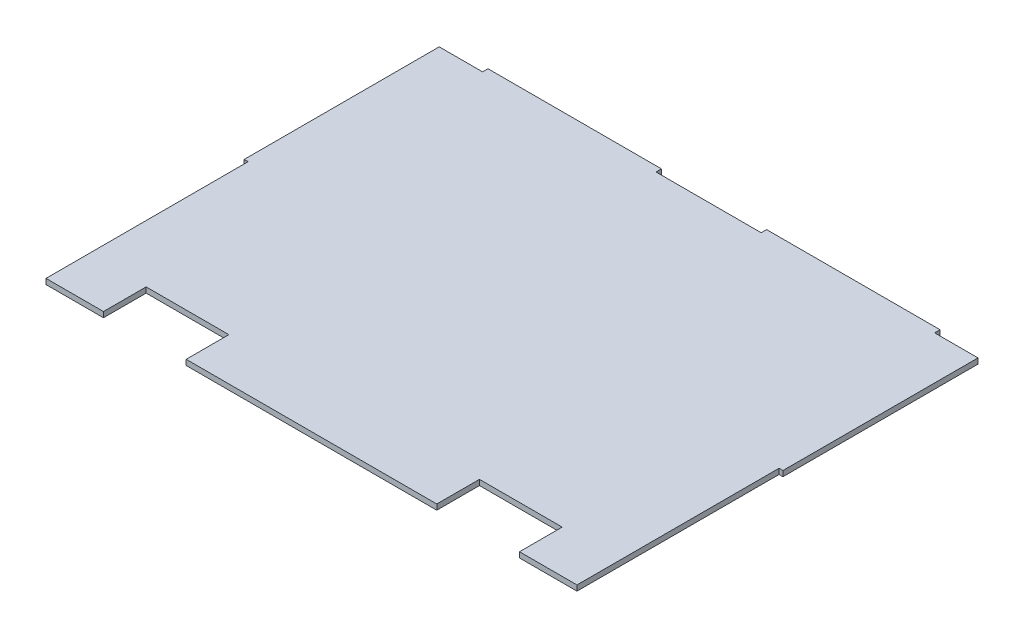
ISO-10303-21;
HEADER;
FILE_DESCRIPTION(('STEP AP214'),'2;1');
FILE_NAME('part.step','',(''),(''),'','','');
FILE_SCHEMA(('AUTOMOTIVE_DESIGN { 1 0 10303 214 1 1 1 1 }'));
ENDSEC;
DATA;
#1=APPLICATION_CONTEXT('core data for automotive mechanical design processes');
#2=APPLICATION_PROTOCOL_DEFINITION('international standard','automotive_design',2000,#1);
#3=PRODUCT_CONTEXT('',#1,'mechanical');
#4=PRODUCT('Part','Part','',(#3));
#5=PRODUCT_RELATED_PRODUCT_CATEGORY('part','',(#4));
#6=PRODUCT_DEFINITION_FORMATION('','',#4);
#7=PRODUCT_DEFINITION_CONTEXT('part definition',#1,'design');
#8=PRODUCT_DEFINITION('design','',#6,#7);
#9=PRODUCT_DEFINITION_SHAPE('','',#8);
#10=(LENGTH_UNIT() NAMED_UNIT(*) SI_UNIT(.MILLI.,.METRE.));
#11=(NAMED_UNIT(*) PLANE_ANGLE_UNIT() SI_UNIT($,.RADIAN.));
#12=(NAMED_UNIT(*) SI_UNIT($,.STERADIAN.) SOLID_ANGLE_UNIT());
#13=UNCERTAINTY_MEASURE_WITH_UNIT(LENGTH_MEASURE(1.E-05),#10,'distance_accuracy_value','');
#14=(GEOMETRIC_REPRESENTATION_CONTEXT(3) GLOBAL_UNCERTAINTY_ASSIGNED_CONTEXT((#13)) GLOBAL_UNIT_ASSIGNED_CONTEXT((#10,
#11,#12)) REPRESENTATION_CONTEXT('',''));
#15=CARTESIAN_POINT('',(0.,0.,0.));
#16=DIRECTION('',(0.,0.,1.));
#17=DIRECTION('',(1.,0.,0.));
#18=AXIS2_PLACEMENT_3D('',#15,#16,#17);
#19=CARTESIAN_POINT('',(-157.7875,1.5875,235.775));
#20=DIRECTION('',(0.,-1.,0.));
#21=DIRECTION('',(0.,0.,-1.));
#22=AXIS2_PLACEMENT_3D('',#19,#20,#21);
#23=PLANE('',#22);
#24=DIRECTION('',(0.,0.,1.));
#25=VECTOR('',#24,1.);
#26=CARTESIAN_POINT('',(121.843079802616,1.5875,210.775));
#27=LINE('',#26,#25);
#28=CARTESIAN_POINT('',(121.843079802616,1.5875,210.775));
#29=VERTEX_POINT('',#28);
#30=CARTESIAN_POINT('',(121.843079802616,1.5875,235.775));
#31=VERTEX_POINT('',#30);
#32=EDGE_CURVE('E217',#29,#31,#27,.T.);
#33=ORIENTED_EDGE('',*,*,#32,.T.);
#34=DIRECTION('',(-1.,0.,0.));
#35=VECTOR('',#34,1.);
#36=CARTESIAN_POINT('',(-157.7875,1.5875,235.775));
#37=LINE('',#36,#35);
#38=CARTESIAN_POINT('',(155.5015,1.5875,235.775));
#39=VERTEX_POINT('',#38);
#40=EDGE_CURVE('E356',#39,#31,#37,.T.);
#41=ORIENTED_EDGE('',*,*,#40,.F.);
#42=DIRECTION('',(0.,0.,-1.));
#43=VECTOR('',#42,1.);
#44=CARTESIAN_POINT('',(155.5015,1.5875,235.775));
#45=LINE('',#44,#43);
#46=CARTESIAN_POINT('',(155.5015,1.5875,117.411));
#47=VERTEX_POINT('',#46);
#48=EDGE_CURVE('E273',#39,#47,#45,.T.);
#49=ORIENTED_EDGE('',*,*,#48,.T.);
#50=DIRECTION('',(-1.,0.,0.));
#51=VECTOR('',#50,1.);
#52=CARTESIAN_POINT('',(-157.7875,1.5875,117.411));
#53=LINE('',#52,#51);
#54=CARTESIAN_POINT('',(157.7875,1.5875,117.411));
#55=VERTEX_POINT('',#54);
#56=EDGE_CURVE('E271',#55,#47,#53,.T.);
#57=ORIENTED_EDGE('',*,*,#56,.F.);
#58=DIRECTION('',(0.,0.,-1.));
#59=VECTOR('',#58,1.);
#60=CARTESIAN_POINT('',(157.7875,1.5875,235.775));
#61=LINE('',#60,#59);
#62=CARTESIAN_POINT('',(157.7875,1.5875,3.175));
#63=VERTEX_POINT('',#62);
#64=EDGE_CURVE('E378',#55,#63,#61,.T.);
#65=ORIENTED_EDGE('',*,*,#64,.T.);
#66=DIRECTION('',(1.,0.,0.));
#67=VECTOR('',#66,1.);
#68=CARTESIAN_POINT('',(0.,1.5875,3.175));
#69=LINE('',#68,#67);
#70=CARTESIAN_POINT('',(132.3875,1.5875,3.175));
#71=VERTEX_POINT('',#70);
#72=EDGE_CURVE('E299',#71,#63,#69,.T.);
#73=ORIENTED_EDGE('',*,*,#72,.F.);
#74=DIRECTION('',(0.,0.,-1.));
#75=VECTOR('',#74,1.);
#76=CARTESIAN_POINT('',(132.3875,1.5875,3.175));
#77=LINE('',#76,#75);
#78=CARTESIAN_POINT('',(132.3875,1.5875,0.));
#79=VERTEX_POINT('',#78);
#80=EDGE_CURVE('E308',#71,#79,#77,.T.);
#81=ORIENTED_EDGE('',*,*,#80,.T.);
#82=DIRECTION('',(-1.,0.,0.));
#83=VECTOR('',#82,1.);
#84=CARTESIAN_POINT('',(-157.7875,1.5875,0.));
#85=LINE('',#84,#83);
#86=CARTESIAN_POINT('',(30.7875000000001,1.5875,0.));
#87=VERTEX_POINT('',#86);
#88=EDGE_CURVE('E368',#79,#87,#85,.T.);
#89=ORIENTED_EDGE('',*,*,#88,.T.);
#90=DIRECTION('',(0.,0.,-1.));
#91=VECTOR('',#90,1.);
#92=CARTESIAN_POINT('',(30.7875000000001,1.5875,3.175));
#93=LINE('',#92,#91);
#94=CARTESIAN_POINT('',(30.7875000000001,1.5875,3.175));
#95=VERTEX_POINT('',#94);
#96=EDGE_CURVE('E333',#95,#87,#93,.T.);
#97=ORIENTED_EDGE('',*,*,#96,.F.);
#98=DIRECTION('',(1.,0.,0.));
#99=VECTOR('',#98,1.);
#100=CARTESIAN_POINT('',(0.,1.5875,3.175));
#101=LINE('',#100,#99);
#102=CARTESIAN_POINT('',(-30.7875000000001,1.5875,3.175));
#103=VERTEX_POINT('',#102);
#104=EDGE_CURVE('E320',#103,#95,#101,.T.);
#105=ORIENTED_EDGE('',*,*,#104,.F.);
#106=DIRECTION('',(0.,0.,-1.));
#107=VECTOR('',#106,1.);
#108=CARTESIAN_POINT('',(-30.7875000000001,1.5875,3.175));
#109=LINE('',#108,#107);
#110=CARTESIAN_POINT('',(-30.7875000000001,1.5875,0.));
#111=VERTEX_POINT('',#110);
#112=EDGE_CURVE('E335',#103,#111,#109,.T.);
#113=ORIENTED_EDGE('',*,*,#112,.T.);
#114=CARTESIAN_POINT('',(-132.3875,1.5875,0.));
#115=VERTEX_POINT('',#114);
#116=EDGE_CURVE('E311',#111,#115,#85,.T.);
#117=ORIENTED_EDGE('',*,*,#116,.T.);
#118=DIRECTION('',(0.,0.,-1.));
#119=VECTOR('',#118,1.);
#120=CARTESIAN_POINT('',(-132.3875,1.5875,3.175));
#121=LINE('',#120,#119);
#122=CARTESIAN_POINT('',(-132.3875,1.5875,3.175));
#123=VERTEX_POINT('',#122);
#124=EDGE_CURVE('E328',#123,#115,#121,.T.);
#125=ORIENTED_EDGE('',*,*,#124,.F.);
#126=DIRECTION('',(1.,0.,0.));
#127=VECTOR('',#126,1.);
#128=CARTESIAN_POINT('',(0.,1.5875,3.175));
#129=LINE('',#128,#127);
#130=CARTESIAN_POINT('',(-157.7875,1.5875,3.175));
#131=VERTEX_POINT('',#130);
#132=EDGE_CURVE('E347',#131,#123,#129,.T.);
#133=ORIENTED_EDGE('',*,*,#132,.F.);
#134=DIRECTION('',(0.,0.,-1.));
#135=VECTOR('',#134,1.);
#136=CARTESIAN_POINT('',(-157.7875,1.5875,235.775));
#137=LINE('',#136,#135);
#138=CARTESIAN_POINT('',(-157.7875,1.5875,117.411));
#139=VERTEX_POINT('',#138);
#140=EDGE_CURVE('E376',#139,#131,#137,.T.);
#141=ORIENTED_EDGE('',*,*,#140,.F.);
#142=DIRECTION('',(1.,0.,0.));
#143=VECTOR('',#142,1.);
#144=CARTESIAN_POINT('',(-157.7875,1.5875,117.411));
#145=LINE('',#144,#143);
#146=CARTESIAN_POINT('',(-155.5015,1.5875,117.411));
#147=VERTEX_POINT('',#146);
#148=EDGE_CURVE('E288',#139,#147,#145,.T.);
#149=ORIENTED_EDGE('',*,*,#148,.T.);
#150=DIRECTION('',(0.,0.,-1.));
#151=VECTOR('',#150,1.);
#152=CARTESIAN_POINT('',(-155.5015,1.5875,235.775));
#153=LINE('',#152,#151);
#154=CARTESIAN_POINT('',(-155.5015,1.5875,235.775));
#155=VERTEX_POINT('',#154);
#156=EDGE_CURVE('E286',#155,#147,#153,.T.);
#157=ORIENTED_EDGE('',*,*,#156,.F.);
#158=CARTESIAN_POINT('',(-121.843079802616,1.5875,235.775));
#159=VERTEX_POINT('',#158);
#160=EDGE_CURVE('E360',#159,#155,#37,.T.);
#161=ORIENTED_EDGE('',*,*,#160,.F.);
#162=DIRECTION('',(0.,0.,1.));
#163=VECTOR('',#162,1.);
#164=CARTESIAN_POINT('',(-121.843079802616,1.5875,210.775));
#165=LINE('',#164,#163);
#166=CARTESIAN_POINT('',(-121.843079802616,1.5875,210.775));
#167=VERTEX_POINT('',#166);
#168=EDGE_CURVE('E233',#167,#159,#165,.T.);
#169=ORIENTED_EDGE('',*,*,#168,.F.);
#170=DIRECTION('',(-1.,0.,0.));
#171=VECTOR('',#170,1.);
#172=CARTESIAN_POINT('',(-121.843079802616,1.5875,210.775));
#173=LINE('',#172,#171);
#174=CARTESIAN_POINT('',(-73.3889861251206,1.5875,210.775));
#175=VERTEX_POINT('',#174);
#176=EDGE_CURVE('E240',#175,#167,#173,.T.);
#177=ORIENTED_EDGE('',*,*,#176,.F.);
#178=DIRECTION('',(0.,0.,-1.));
#179=VECTOR('',#178,1.);
#180=CARTESIAN_POINT('',(-73.3889861251206,1.5875,210.775));
#181=LINE('',#180,#179);
#182=CARTESIAN_POINT('',(-73.3889861251206,1.5875,235.775));
#183=VERTEX_POINT('',#182);
#184=EDGE_CURVE('E247',#183,#175,#181,.T.);
#185=ORIENTED_EDGE('',*,*,#184,.F.);
#186=CARTESIAN_POINT('',(73.3889861251206,1.5875,235.775));
#187=VERTEX_POINT('',#186);
#188=EDGE_CURVE('E359',#187,#183,#37,.T.);
#189=ORIENTED_EDGE('',*,*,#188,.F.);
#190=DIRECTION('',(0.,0.,-1.));
#191=VECTOR('',#190,1.);
#192=CARTESIAN_POINT('',(73.3889861251206,1.5875,210.775));
#193=LINE('',#192,#191);
#194=CARTESIAN_POINT('',(73.3889861251206,1.5875,210.775));
#195=VERTEX_POINT('',#194);
#196=EDGE_CURVE('E54',#187,#195,#193,.T.);
#197=ORIENTED_EDGE('',*,*,#196,.T.);
#198=DIRECTION('',(1.,0.,0.));
#199=VECTOR('',#198,1.);
#200=CARTESIAN_POINT('',(121.843079802616,1.5875,210.775));
#201=LINE('',#200,#199);
#202=EDGE_CURVE('E225',#195,#29,#201,.T.);
#203=ORIENTED_EDGE('',*,*,#202,.T.);
#204=EDGE_LOOP('',(#33,#41,#49,#57,#65,#73,#81,#89,#97,#105,#113,#117,#125,#133,#141,#149,#157,
#161,#169,#177,#185,#189,#197,#203));
#205=FACE_BOUND('',#204,.T.);
#206=ADVANCED_FACE('F39',(#205),#23,.F.);
#207=CARTESIAN_POINT('',(-157.7875,-1.5875,235.775));
#208=DIRECTION('',(0.,1.,0.));
#209=DIRECTION('',(0.,0.,1.));
#210=AXIS2_PLACEMENT_3D('',#207,#208,#209);
#211=PLANE('',#210);
#212=DIRECTION('',(0.,0.,1.));
#213=VECTOR('',#212,1.);
#214=CARTESIAN_POINT('',(121.843079802616,-1.5875,210.775));
#215=LINE('',#214,#213);
#216=CARTESIAN_POINT('',(121.843079802616,-1.5875,210.775));
#217=VERTEX_POINT('',#216);
#218=CARTESIAN_POINT('',(121.843079802616,-1.5875,235.775));
#219=VERTEX_POINT('',#218);
#220=EDGE_CURVE('E211',#217,#219,#215,.T.);
#221=ORIENTED_EDGE('',*,*,#220,.F.);
#222=DIRECTION('',(1.,0.,0.));
#223=VECTOR('',#222,1.);
#224=CARTESIAN_POINT('',(121.843079802616,-1.5875,210.775));
#225=LINE('',#224,#223);
#226=CARTESIAN_POINT('',(73.3889861251206,-1.5875,210.775));
#227=VERTEX_POINT('',#226);
#228=EDGE_CURVE('E200',#227,#217,#225,.T.);
#229=ORIENTED_EDGE('',*,*,#228,.F.);
#230=DIRECTION('',(0.,0.,-1.));
#231=VECTOR('',#230,1.);
#232=CARTESIAN_POINT('',(73.3889861251206,-1.5875,210.775));
#233=LINE('',#232,#231);
#234=CARTESIAN_POINT('',(73.3889861251206,-1.5875,235.775));
#235=VERTEX_POINT('',#234);
#236=EDGE_CURVE('E210',#235,#227,#233,.T.);
#237=ORIENTED_EDGE('',*,*,#236,.F.);
#238=DIRECTION('',(1.,0.,0.));
#239=VECTOR('',#238,1.);
#240=CARTESIAN_POINT('',(-157.7875,-1.5875,235.775));
#241=LINE('',#240,#239);
#242=CARTESIAN_POINT('',(-73.3889861251206,-1.5875,235.775));
#243=VERTEX_POINT('',#242);
#244=EDGE_CURVE('E365',#243,#235,#241,.T.);
#245=ORIENTED_EDGE('',*,*,#244,.F.);
#246=DIRECTION('',(0.,0.,-1.));
#247=VECTOR('',#246,1.);
#248=CARTESIAN_POINT('',(-73.3889861251206,-1.5875,210.775));
#249=LINE('',#248,#247);
#250=CARTESIAN_POINT('',(-73.3889861251206,-1.5875,210.775));
#251=VERTEX_POINT('',#250);
#252=EDGE_CURVE('E62',#243,#251,#249,.T.);
#253=ORIENTED_EDGE('',*,*,#252,.T.);
#254=DIRECTION('',(-1.,0.,0.));
#255=VECTOR('',#254,1.);
#256=CARTESIAN_POINT('',(-121.843079802616,-1.5875,210.775));
#257=LINE('',#256,#255);
#258=CARTESIAN_POINT('',(-121.843079802616,-1.5875,210.775));
#259=VERTEX_POINT('',#258);
#260=EDGE_CURVE('E242',#251,#259,#257,.T.);
#261=ORIENTED_EDGE('',*,*,#260,.T.);
#262=DIRECTION('',(0.,0.,1.));
#263=VECTOR('',#262,1.);
#264=CARTESIAN_POINT('',(-121.843079802616,-1.5875,210.775));
#265=LINE('',#264,#263);
#266=CARTESIAN_POINT('',(-121.843079802616,-1.5875,235.775));
#267=VERTEX_POINT('',#266);
#268=EDGE_CURVE('E237',#259,#267,#265,.T.);
#269=ORIENTED_EDGE('',*,*,#268,.T.);
#270=CARTESIAN_POINT('',(-155.5015,-1.5875,235.775));
#271=VERTEX_POINT('',#270);
#272=EDGE_CURVE('E361',#271,#267,#241,.T.);
#273=ORIENTED_EDGE('',*,*,#272,.F.);
#274=DIRECTION('',(0.,0.,-1.));
#275=VECTOR('',#274,1.);
#276=CARTESIAN_POINT('',(-155.5015,-1.5875,0.));
#277=LINE('',#276,#275);
#278=CARTESIAN_POINT('',(-155.5015,-1.5875,117.411));
#279=VERTEX_POINT('',#278);
#280=EDGE_CURVE('E276',#271,#279,#277,.T.);
#281=ORIENTED_EDGE('',*,*,#280,.T.);
#282=DIRECTION('',(1.,0.,0.));
#283=VECTOR('',#282,1.);
#284=CARTESIAN_POINT('',(0.,-1.5875,117.411));
#285=LINE('',#284,#283);
#286=CARTESIAN_POINT('',(-157.7875,-1.5875,117.411));
#287=VERTEX_POINT('',#286);
#288=EDGE_CURVE('E279',#287,#279,#285,.T.);
#289=ORIENTED_EDGE('',*,*,#288,.F.);
#290=DIRECTION('',(0.,0.,-1.));
#291=VECTOR('',#290,1.);
#292=CARTESIAN_POINT('',(-157.7875,-1.5875,235.775));
#293=LINE('',#292,#291);
#294=CARTESIAN_POINT('',(-157.7875,-1.5875,3.175));
#295=VERTEX_POINT('',#294);
#296=EDGE_CURVE('E374',#287,#295,#293,.T.);
#297=ORIENTED_EDGE('',*,*,#296,.T.);
#298=DIRECTION('',(-1.,0.,0.));
#299=VECTOR('',#298,1.);
#300=CARTESIAN_POINT('',(0.,-1.5875,3.175));
#301=LINE('',#300,#299);
#302=CARTESIAN_POINT('',(-132.3875,-1.5875,3.175));
#303=VERTEX_POINT('',#302);
#304=EDGE_CURVE('E341',#303,#295,#301,.T.);
#305=ORIENTED_EDGE('',*,*,#304,.F.);
#306=DIRECTION('',(0.,0.,-1.));
#307=VECTOR('',#306,1.);
#308=CARTESIAN_POINT('',(-132.3875,-1.5875,3.175));
#309=LINE('',#308,#307);
#310=CARTESIAN_POINT('',(-132.3875,-1.5875,0.));
#311=VERTEX_POINT('',#310);
#312=EDGE_CURVE('E350',#303,#311,#309,.T.);
#313=ORIENTED_EDGE('',*,*,#312,.T.);
#314=DIRECTION('',(1.,0.,0.));
#315=VECTOR('',#314,1.);
#316=CARTESIAN_POINT('',(-157.7875,-1.5875,0.));
#317=LINE('',#316,#315);
#318=CARTESIAN_POINT('',(-30.7875000000001,-1.5875,0.));
#319=VERTEX_POINT('',#318);
#320=EDGE_CURVE('E372',#311,#319,#317,.T.);
#321=ORIENTED_EDGE('',*,*,#320,.T.);
#322=DIRECTION('',(0.,0.,-1.));
#323=VECTOR('',#322,1.);
#324=CARTESIAN_POINT('',(-30.7875000000001,-1.5875,3.175));
#325=LINE('',#324,#323);
#326=CARTESIAN_POINT('',(-30.7875000000001,-1.5875,3.175));
#327=VERTEX_POINT('',#326);
#328=EDGE_CURVE('E325',#327,#319,#325,.T.);
#329=ORIENTED_EDGE('',*,*,#328,.F.);
#330=DIRECTION('',(-1.,0.,0.));
#331=VECTOR('',#330,1.);
#332=CARTESIAN_POINT('',(0.,-1.5875,3.175));
#333=LINE('',#332,#331);
#334=CARTESIAN_POINT('',(30.7875000000001,-1.5875,3.175));
#335=VERTEX_POINT('',#334);
#336=EDGE_CURVE('E313',#335,#327,#333,.T.);
#337=ORIENTED_EDGE('',*,*,#336,.F.);
#338=DIRECTION('',(0.,0.,-1.));
#339=VECTOR('',#338,1.);
#340=CARTESIAN_POINT('',(30.7875000000001,-1.5875,3.175));
#341=LINE('',#340,#339);
#342=CARTESIAN_POINT('',(30.7875000000001,-1.5875,0.));
#343=VERTEX_POINT('',#342);
#344=EDGE_CURVE('E307',#335,#343,#341,.T.);
#345=ORIENTED_EDGE('',*,*,#344,.T.);
#346=CARTESIAN_POINT('',(132.3875,-1.5875,0.));
#347=VERTEX_POINT('',#346);
#348=EDGE_CURVE('E369',#343,#347,#317,.T.);
#349=ORIENTED_EDGE('',*,*,#348,.T.);
#350=DIRECTION('',(0.,0.,-1.));
#351=VECTOR('',#350,1.);
#352=CARTESIAN_POINT('',(132.3875,-1.5875,3.175));
#353=LINE('',#352,#351);
#354=CARTESIAN_POINT('',(132.3875,-1.5875,3.175));
#355=VERTEX_POINT('',#354);
#356=EDGE_CURVE('E305',#355,#347,#353,.T.);
#357=ORIENTED_EDGE('',*,*,#356,.F.);
#358=DIRECTION('',(-1.,0.,0.));
#359=VECTOR('',#358,1.);
#360=CARTESIAN_POINT('',(0.,-1.5875,3.175));
#361=LINE('',#360,#359);
#362=CARTESIAN_POINT('',(157.7875,-1.5875,3.175));
#363=VERTEX_POINT('',#362);
#364=EDGE_CURVE('E292',#363,#355,#361,.T.);
#365=ORIENTED_EDGE('',*,*,#364,.F.);
#366=DIRECTION('',(0.,0.,-1.));
#367=VECTOR('',#366,1.);
#368=CARTESIAN_POINT('',(157.7875,-1.5875,235.775));
#369=LINE('',#368,#367);
#370=CARTESIAN_POINT('',(157.7875,-1.5875,117.411));
#371=VERTEX_POINT('',#370);
#372=EDGE_CURVE('E364',#371,#363,#369,.T.);
#373=ORIENTED_EDGE('',*,*,#372,.F.);
#374=DIRECTION('',(-1.,0.,0.));
#375=VECTOR('',#374,1.);
#376=CARTESIAN_POINT('',(0.,-1.5875,117.411));
#377=LINE('',#376,#375);
#378=CARTESIAN_POINT('',(155.5015,-1.5875,117.411));
#379=VERTEX_POINT('',#378);
#380=EDGE_CURVE('E254',#371,#379,#377,.T.);
#381=ORIENTED_EDGE('',*,*,#380,.T.);
#382=DIRECTION('',(0.,0.,-1.));
#383=VECTOR('',#382,1.);
#384=CARTESIAN_POINT('',(155.5015,-1.5875,0.));
#385=LINE('',#384,#383);
#386=CARTESIAN_POINT('',(155.5015,-1.5875,235.775));
#387=VERTEX_POINT('',#386);
#388=EDGE_CURVE('E263',#387,#379,#385,.T.);
#389=ORIENTED_EDGE('',*,*,#388,.F.);
#390=EDGE_CURVE('E223',#219,#387,#241,.T.);
#391=ORIENTED_EDGE('',*,*,#390,.F.);
#392=EDGE_LOOP('',(#221,#229,#237,#245,#253,#261,#269,#273,#281,#289,#297,#305,#313,#321,#329,
#337,#345,#349,#357,#365,#373,#381,#389,#391));
#393=FACE_BOUND('',#392,.T.);
#394=ADVANCED_FACE('F221',(#393),#211,.F.);
#395=CARTESIAN_POINT('',(0.,0.,235.775));
#396=DIRECTION('',(0.,0.,-1.));
#397=DIRECTION('',(-1.,0.,0.));
#398=AXIS2_PLACEMENT_3D('',#395,#396,#397);
#399=PLANE('',#398);
#400=DIRECTION('',(0.,1.,0.));
#401=VECTOR('',#400,1.);
#402=CARTESIAN_POINT('',(121.843079802616,-1.5875,235.775));
#403=LINE('',#402,#401);
#404=EDGE_CURVE('E231',#219,#31,#403,.T.);
#405=ORIENTED_EDGE('',*,*,#404,.F.);
#406=ORIENTED_EDGE('',*,*,#390,.T.);
#407=DIRECTION('',(0.,-1.,0.));
#408=VECTOR('',#407,1.);
#409=CARTESIAN_POINT('',(155.5015,1.587512,235.775));
#410=LINE('',#409,#408);
#411=EDGE_CURVE('E266',#39,#387,#410,.T.);
#412=ORIENTED_EDGE('',*,*,#411,.F.);
#413=ORIENTED_EDGE('',*,*,#40,.T.);
#414=EDGE_LOOP('',(#405,#406,#412,#413));
#415=FACE_BOUND('',#414,.T.);
#416=ADVANCED_FACE('F428',(#415),#399,.F.);
#417=DIRECTION('',(0.,1.,0.));
#418=VECTOR('',#417,1.);
#419=CARTESIAN_POINT('',(73.3889861251206,-1.5875,235.775));
#420=LINE('',#419,#418);
#421=EDGE_CURVE('E234',#235,#187,#420,.T.);
#422=ORIENTED_EDGE('',*,*,#421,.T.);
#423=ORIENTED_EDGE('',*,*,#188,.T.);
#424=DIRECTION('',(0.,1.,0.));
#425=VECTOR('',#424,1.);
#426=CARTESIAN_POINT('',(-73.3889861251206,-1.5875,235.775));
#427=LINE('',#426,#425);
#428=EDGE_CURVE('E257',#243,#183,#427,.T.);
#429=ORIENTED_EDGE('',*,*,#428,.F.);
#430=ORIENTED_EDGE('',*,*,#244,.T.);
#431=EDGE_LOOP('',(#422,#423,#429,#430));
#432=FACE_BOUND('',#431,.T.);
#433=ADVANCED_FACE('F416',(#432),#399,.F.);
#434=ORIENTED_EDGE('',*,*,#272,.T.);
#435=DIRECTION('',(0.,1.,0.));
#436=VECTOR('',#435,1.);
#437=CARTESIAN_POINT('',(-121.843079802616,-1.5875,235.775));
#438=LINE('',#437,#436);
#439=EDGE_CURVE('E245',#267,#159,#438,.T.);
#440=ORIENTED_EDGE('',*,*,#439,.T.);
#441=ORIENTED_EDGE('',*,*,#160,.T.);
#442=DIRECTION('',(0.,1.,0.));
#443=VECTOR('',#442,1.);
#444=CARTESIAN_POINT('',(-155.5015,0.,235.775));
#445=LINE('',#444,#443);
#446=EDGE_CURVE('E47',#271,#155,#445,.T.);
#447=ORIENTED_EDGE('',*,*,#446,.F.);
#448=EDGE_LOOP('',(#434,#440,#441,#447));
#449=FACE_BOUND('',#448,.T.);
#450=ADVANCED_FACE('F485',(#449),#399,.F.);
#451=CARTESIAN_POINT('',(157.7875,-1.5875,235.775));
#452=DIRECTION('',(-1.,0.,0.));
#453=DIRECTION('',(0.,0.,1.));
#454=AXIS2_PLACEMENT_3D('',#451,#452,#453);
#455=PLANE('',#454);
#456=DIRECTION('',(0.,1.,0.));
#457=VECTOR('',#456,1.);
#458=CARTESIAN_POINT('',(157.7875,-1.5875,117.411));
#459=LINE('',#458,#457);
#460=EDGE_CURVE('E11',#371,#55,#459,.T.);
#461=ORIENTED_EDGE('',*,*,#460,.F.);
#462=ORIENTED_EDGE('',*,*,#372,.T.);
#463=DIRECTION('',(0.,-1.,0.));
#464=VECTOR('',#463,1.);
#465=CARTESIAN_POINT('',(157.7875,0.,3.175));
#466=LINE('',#465,#464);
#467=EDGE_CURVE('E302',#63,#363,#466,.T.);
#468=ORIENTED_EDGE('',*,*,#467,.F.);
#469=ORIENTED_EDGE('',*,*,#64,.F.);
#470=EDGE_LOOP('',(#461,#462,#468,#469));
#471=FACE_BOUND('',#470,.T.);
#472=ADVANCED_FACE('F41',(#471),#455,.F.);
#473=CARTESIAN_POINT('',(-157.7875,-1.5875,235.775));
#474=DIRECTION('',(1.,0.,0.));
#475=DIRECTION('',(0.,0.,-1.));
#476=AXIS2_PLACEMENT_3D('',#473,#474,#475);
#477=PLANE('',#476);
#478=ORIENTED_EDGE('',*,*,#296,.F.);
#479=DIRECTION('',(0.,-1.,0.));
#480=VECTOR('',#479,1.);
#481=CARTESIAN_POINT('',(-157.7875,1.587512,117.411));
#482=LINE('',#481,#480);
#483=EDGE_CURVE('E282',#139,#287,#482,.T.);
#484=ORIENTED_EDGE('',*,*,#483,.F.);
#485=ORIENTED_EDGE('',*,*,#140,.T.);
#486=DIRECTION('',(0.,1.,0.));
#487=VECTOR('',#486,1.);
#488=CARTESIAN_POINT('',(-157.7875,0.,3.175));
#489=LINE('',#488,#487);
#490=EDGE_CURVE('E344',#295,#131,#489,.T.);
#491=ORIENTED_EDGE('',*,*,#490,.F.);
#492=EDGE_LOOP('',(#478,#484,#485,#491));
#493=FACE_BOUND('',#492,.T.);
#494=ADVANCED_FACE('F398',(#493),#477,.F.);
#495=CARTESIAN_POINT('',(0.,0.,0.));
#496=DIRECTION('',(0.,0.,-1.));
#497=DIRECTION('',(-1.,0.,0.));
#498=AXIS2_PLACEMENT_3D('',#495,#496,#497);
#499=PLANE('',#498);
#500=DIRECTION('',(0.,1.,0.));
#501=VECTOR('',#500,1.);
#502=CARTESIAN_POINT('',(132.3875,0.,0.));
#503=LINE('',#502,#501);
#504=EDGE_CURVE('E296',#347,#79,#503,.T.);
#505=ORIENTED_EDGE('',*,*,#504,.F.);
#506=ORIENTED_EDGE('',*,*,#348,.F.);
#507=DIRECTION('',(0.,1.,0.));
#508=VECTOR('',#507,1.);
#509=CARTESIAN_POINT('',(30.7875000000001,0.,0.));
#510=LINE('',#509,#508);
#511=EDGE_CURVE('E317',#343,#87,#510,.T.);
#512=ORIENTED_EDGE('',*,*,#511,.T.);
#513=ORIENTED_EDGE('',*,*,#88,.F.);
#514=EDGE_LOOP('',(#505,#506,#512,#513));
#515=FACE_BOUND('',#514,.T.);
#516=ADVANCED_FACE('F453',(#515),#499,.T.);
#517=DIRECTION('',(0.,1.,0.));
#518=VECTOR('',#517,1.);
#519=CARTESIAN_POINT('',(-30.7875000000001,0.,0.));
#520=LINE('',#519,#518);
#521=EDGE_CURVE('E326',#319,#111,#520,.T.);
#522=ORIENTED_EDGE('',*,*,#521,.F.);
#523=ORIENTED_EDGE('',*,*,#320,.F.);
#524=DIRECTION('',(0.,1.,0.));
#525=VECTOR('',#524,1.);
#526=CARTESIAN_POINT('',(-132.3875,0.,0.));
#527=LINE('',#526,#525);
#528=EDGE_CURVE('E291',#311,#115,#527,.T.);
#529=ORIENTED_EDGE('',*,*,#528,.T.);
#530=ORIENTED_EDGE('',*,*,#116,.F.);
#531=EDGE_LOOP('',(#522,#523,#529,#530));
#532=FACE_BOUND('',#531,.T.);
#533=ADVANCED_FACE('F412',(#532),#499,.T.);
#534=CARTESIAN_POINT('',(-132.3875,0.,3.175));
#535=DIRECTION('',(-1.,0.,0.));
#536=DIRECTION('',(0.,0.,1.));
#537=AXIS2_PLACEMENT_3D('',#534,#535,#536);
#538=PLANE('',#537);
#539=ORIENTED_EDGE('',*,*,#528,.F.);
#540=ORIENTED_EDGE('',*,*,#312,.F.);
#541=DIRECTION('',(0.,1.,0.));
#542=VECTOR('',#541,1.);
#543=CARTESIAN_POINT('',(-132.3875,0.,3.175));
#544=LINE('',#543,#542);
#545=EDGE_CURVE('E339',#303,#123,#544,.T.);
#546=ORIENTED_EDGE('',*,*,#545,.T.);
#547=ORIENTED_EDGE('',*,*,#124,.T.);
#548=EDGE_LOOP('',(#539,#540,#546,#547));
#549=FACE_BOUND('',#548,.T.);
#550=ADVANCED_FACE('F406',(#549),#538,.T.);
#551=CARTESIAN_POINT('',(0.,0.,3.175));
#552=DIRECTION('',(0.,0.,-1.));
#553=DIRECTION('',(-1.,0.,0.));
#554=AXIS2_PLACEMENT_3D('',#551,#552,#553);
#555=PLANE('',#554);
#556=ORIENTED_EDGE('',*,*,#545,.F.);
#557=ORIENTED_EDGE('',*,*,#304,.T.);
#558=ORIENTED_EDGE('',*,*,#490,.T.);
#559=ORIENTED_EDGE('',*,*,#132,.T.);
#560=EDGE_LOOP('',(#556,#557,#558,#559));
#561=FACE_BOUND('',#560,.T.);
#562=ADVANCED_FACE('F403',(#561),#555,.T.);
#563=CARTESIAN_POINT('',(30.7875000000001,0.,3.175));
#564=DIRECTION('',(-1.,0.,0.));
#565=DIRECTION('',(0.,-1.,0.));
#566=AXIS2_PLACEMENT_3D('',#563,#564,#565);
#567=PLANE('',#566);
#568=ORIENTED_EDGE('',*,*,#511,.F.);
#569=ORIENTED_EDGE('',*,*,#344,.F.);
#570=DIRECTION('',(0.,1.,0.));
#571=VECTOR('',#570,1.);
#572=CARTESIAN_POINT('',(30.7875000000001,0.,3.175));
#573=LINE('',#572,#571);
#574=EDGE_CURVE('E323',#335,#95,#573,.T.);
#575=ORIENTED_EDGE('',*,*,#574,.T.);
#576=ORIENTED_EDGE('',*,*,#96,.T.);
#577=EDGE_LOOP('',(#568,#569,#575,#576));
#578=FACE_BOUND('',#577,.T.);
#579=ADVANCED_FACE('F456',(#578),#567,.T.);
#580=CARTESIAN_POINT('',(-30.7875000000001,0.,3.175));
#581=DIRECTION('',(-1.,0.,0.));
#582=DIRECTION('',(0.,-1.,0.));
#583=AXIS2_PLACEMENT_3D('',#580,#581,#582);
#584=PLANE('',#583);
#585=ORIENTED_EDGE('',*,*,#521,.T.);
#586=ORIENTED_EDGE('',*,*,#112,.F.);
#587=DIRECTION('',(0.,1.,0.));
#588=VECTOR('',#587,1.);
#589=CARTESIAN_POINT('',(-30.7875000000001,0.,3.175));
#590=LINE('',#589,#588);
#591=EDGE_CURVE('E316',#327,#103,#590,.T.);
#592=ORIENTED_EDGE('',*,*,#591,.F.);
#593=ORIENTED_EDGE('',*,*,#328,.T.);
#594=EDGE_LOOP('',(#585,#586,#592,#593));
#595=FACE_BOUND('',#594,.T.);
#596=ADVANCED_FACE('F463',(#595),#584,.F.);
#597=CARTESIAN_POINT('',(0.,0.,3.175));
#598=DIRECTION('',(0.,0.,-1.));
#599=DIRECTION('',(-1.,0.,0.));
#600=AXIS2_PLACEMENT_3D('',#597,#598,#599);
#601=PLANE('',#600);
#602=ORIENTED_EDGE('',*,*,#336,.T.);
#603=ORIENTED_EDGE('',*,*,#591,.T.);
#604=ORIENTED_EDGE('',*,*,#104,.T.);
#605=ORIENTED_EDGE('',*,*,#574,.F.);
#606=EDGE_LOOP('',(#602,#603,#604,#605));
#607=FACE_BOUND('',#606,.T.);
#608=ADVANCED_FACE('F460',(#607),#601,.T.);
#609=CARTESIAN_POINT('',(132.3875,0.,3.175));
#610=DIRECTION('',(-1.,0.,0.));
#611=DIRECTION('',(0.,0.,1.));
#612=AXIS2_PLACEMENT_3D('',#609,#610,#611);
#613=PLANE('',#612);
#614=ORIENTED_EDGE('',*,*,#504,.T.);
#615=ORIENTED_EDGE('',*,*,#80,.F.);
#616=DIRECTION('',(0.,1.,0.));
#617=VECTOR('',#616,1.);
#618=CARTESIAN_POINT('',(132.3875,0.,3.175));
#619=LINE('',#618,#617);
#620=EDGE_CURVE('E295',#355,#71,#619,.T.);
#621=ORIENTED_EDGE('',*,*,#620,.F.);
#622=ORIENTED_EDGE('',*,*,#356,.T.);
#623=EDGE_LOOP('',(#614,#615,#621,#622));
#624=FACE_BOUND('',#623,.T.);
#625=ADVANCED_FACE('F447',(#624),#613,.F.);
#626=CARTESIAN_POINT('',(0.,0.,3.175));
#627=DIRECTION('',(0.,0.,-1.));
#628=DIRECTION('',(-1.,0.,0.));
#629=AXIS2_PLACEMENT_3D('',#626,#627,#628);
#630=PLANE('',#629);
#631=ORIENTED_EDGE('',*,*,#364,.T.);
#632=ORIENTED_EDGE('',*,*,#620,.T.);
#633=ORIENTED_EDGE('',*,*,#72,.T.);
#634=ORIENTED_EDGE('',*,*,#467,.T.);
#635=EDGE_LOOP('',(#631,#632,#633,#634));
#636=FACE_BOUND('',#635,.T.);
#637=ADVANCED_FACE('F444',(#636),#630,.T.);
#638=CARTESIAN_POINT('',(0.,1.587512,117.411));
#639=DIRECTION('',(0.,0.,-1.));
#640=DIRECTION('',(-1.,0.,0.));
#641=AXIS2_PLACEMENT_3D('',#638,#639,#640);
#642=PLANE('',#641);
#643=ORIENTED_EDGE('',*,*,#483,.T.);
#644=ORIENTED_EDGE('',*,*,#288,.T.);
#645=DIRECTION('',(0.,-1.,0.));
#646=VECTOR('',#645,1.);
#647=CARTESIAN_POINT('',(-155.5015,1.587512,117.411));
#648=LINE('',#647,#646);
#649=EDGE_CURVE('E284',#147,#279,#648,.T.);
#650=ORIENTED_EDGE('',*,*,#649,.F.);
#651=ORIENTED_EDGE('',*,*,#148,.F.);
#652=EDGE_LOOP('',(#643,#644,#650,#651));
#653=FACE_BOUND('',#652,.T.);
#654=ADVANCED_FACE('F394',(#653),#642,.F.);
#655=CARTESIAN_POINT('',(-155.5015,1.587512,0.));
#656=DIRECTION('',(-1.,0.,0.));
#657=DIRECTION('',(0.,0.,1.));
#658=AXIS2_PLACEMENT_3D('',#655,#656,#657);
#659=PLANE('',#658);
#660=ORIENTED_EDGE('',*,*,#156,.T.);
#661=ORIENTED_EDGE('',*,*,#649,.T.);
#662=ORIENTED_EDGE('',*,*,#280,.F.);
#663=ORIENTED_EDGE('',*,*,#446,.T.);
#664=EDGE_LOOP('',(#660,#661,#662,#663));
#665=FACE_BOUND('',#664,.T.);
#666=ADVANCED_FACE('F383',(#665),#659,.T.);
#667=CARTESIAN_POINT('',(155.5015,1.587512,0.));
#668=DIRECTION('',(-1.,0.,0.));
#669=DIRECTION('',(0.,0.,1.));
#670=AXIS2_PLACEMENT_3D('',#667,#668,#669);
#671=PLANE('',#670);
#672=ORIENTED_EDGE('',*,*,#411,.T.);
#673=ORIENTED_EDGE('',*,*,#388,.T.);
#674=DIRECTION('',(0.,-1.,0.));
#675=VECTOR('',#674,1.);
#676=CARTESIAN_POINT('',(155.5015,1.587512,117.411));
#677=LINE('',#676,#675);
#678=EDGE_CURVE('E269',#47,#379,#677,.T.);
#679=ORIENTED_EDGE('',*,*,#678,.F.);
#680=ORIENTED_EDGE('',*,*,#48,.F.);
#681=EDGE_LOOP('',(#672,#673,#679,#680));
#682=FACE_BOUND('',#681,.T.);
#683=ADVANCED_FACE('F431',(#682),#671,.F.);
#684=CARTESIAN_POINT('',(0.,1.587512,117.411));
#685=DIRECTION('',(0.,0.,1.));
#686=DIRECTION('',(1.,0.,0.));
#687=AXIS2_PLACEMENT_3D('',#684,#685,#686);
#688=PLANE('',#687);
#689=ORIENTED_EDGE('',*,*,#56,.T.);
#690=ORIENTED_EDGE('',*,*,#678,.T.);
#691=ORIENTED_EDGE('',*,*,#380,.F.);
#692=ORIENTED_EDGE('',*,*,#460,.T.);
#693=EDGE_LOOP('',(#689,#690,#691,#692));
#694=FACE_BOUND('',#693,.T.);
#695=ADVANCED_FACE('F437',(#694),#688,.T.);
#696=CARTESIAN_POINT('',(-121.843079802616,-1.5875,210.775));
#697=DIRECTION('',(-1.,0.,0.));
#698=DIRECTION('',(0.,0.,1.));
#699=AXIS2_PLACEMENT_3D('',#696,#697,#698);
#700=PLANE('',#699);
#701=ORIENTED_EDGE('',*,*,#168,.T.);
#702=ORIENTED_EDGE('',*,*,#439,.F.);
#703=ORIENTED_EDGE('',*,*,#268,.F.);
#704=DIRECTION('',(0.,1.,0.));
#705=VECTOR('',#704,1.);
#706=CARTESIAN_POINT('',(-121.843079802616,-1.5875,210.775));
#707=LINE('',#706,#705);
#708=EDGE_CURVE('E252',#259,#167,#707,.T.);
#709=ORIENTED_EDGE('',*,*,#708,.T.);
#710=EDGE_LOOP('',(#701,#702,#703,#709));
#711=FACE_BOUND('',#710,.T.);
#712=ADVANCED_FACE('F581',(#711),#700,.F.);
#713=CARTESIAN_POINT('',(-121.843079802616,-1.5875,210.775));
#714=DIRECTION('',(0.,0.,-1.));
#715=DIRECTION('',(-1.,0.,0.));
#716=AXIS2_PLACEMENT_3D('',#713,#714,#715);
#717=PLANE('',#716);
#718=ORIENTED_EDGE('',*,*,#176,.T.);
#719=ORIENTED_EDGE('',*,*,#708,.F.);
#720=ORIENTED_EDGE('',*,*,#260,.F.);
#721=DIRECTION('',(0.,1.,0.));
#722=VECTOR('',#721,1.);
#723=CARTESIAN_POINT('',(-73.3889861251206,-1.5875,210.775));
#724=LINE('',#723,#722);
#725=EDGE_CURVE('E255',#251,#175,#724,.T.);
#726=ORIENTED_EDGE('',*,*,#725,.T.);
#727=EDGE_LOOP('',(#718,#719,#720,#726));
#728=FACE_BOUND('',#727,.T.);
#729=ADVANCED_FACE('F423',(#728),#717,.F.);
#730=CARTESIAN_POINT('',(-73.3889861251206,-1.5875,210.775));
#731=DIRECTION('',(1.,0.,0.));
#732=DIRECTION('',(0.,0.,-1.));
#733=AXIS2_PLACEMENT_3D('',#730,#731,#732);
#734=PLANE('',#733);
#735=ORIENTED_EDGE('',*,*,#184,.T.);
#736=ORIENTED_EDGE('',*,*,#725,.F.);
#737=ORIENTED_EDGE('',*,*,#252,.F.);
#738=ORIENTED_EDGE('',*,*,#428,.T.);
#739=EDGE_LOOP('',(#735,#736,#737,#738));
#740=FACE_BOUND('',#739,.T.);
#741=ADVANCED_FACE('F420',(#740),#734,.F.);
#742=CARTESIAN_POINT('',(121.843079802616,-1.5875,210.775));
#743=DIRECTION('',(-1.,0.,0.));
#744=DIRECTION('',(0.,0.,1.));
#745=AXIS2_PLACEMENT_3D('',#742,#743,#744);
#746=PLANE('',#745);
#747=ORIENTED_EDGE('',*,*,#32,.F.);
#748=DIRECTION('',(0.,1.,0.));
#749=VECTOR('',#748,1.);
#750=CARTESIAN_POINT('',(121.843079802616,-1.5875,210.775));
#751=LINE('',#750,#749);
#752=EDGE_CURVE('E204',#217,#29,#751,.T.);
#753=ORIENTED_EDGE('',*,*,#752,.F.);
#754=ORIENTED_EDGE('',*,*,#220,.T.);
#755=ORIENTED_EDGE('',*,*,#404,.T.);
#756=EDGE_LOOP('',(#747,#753,#754,#755));
#757=FACE_BOUND('',#756,.T.);
#758=ADVANCED_FACE('F214',(#757),#746,.T.);
#759=CARTESIAN_POINT('',(73.3889861251206,-1.5875,210.775));
#760=DIRECTION('',(1.,0.,0.));
#761=DIRECTION('',(0.,0.,-1.));
#762=AXIS2_PLACEMENT_3D('',#759,#760,#761);
#763=PLANE('',#762);
#764=ORIENTED_EDGE('',*,*,#196,.F.);
#765=ORIENTED_EDGE('',*,*,#421,.F.);
#766=ORIENTED_EDGE('',*,*,#236,.T.);
#767=DIRECTION('',(0.,1.,0.));
#768=VECTOR('',#767,1.);
#769=CARTESIAN_POINT('',(73.3889861251206,-1.5875,210.775));
#770=LINE('',#769,#768);
#771=EDGE_CURVE('E206',#227,#195,#770,.T.);
#772=ORIENTED_EDGE('',*,*,#771,.T.);
#773=EDGE_LOOP('',(#764,#765,#766,#772));
#774=FACE_BOUND('',#773,.T.);
#775=ADVANCED_FACE('F652',(#774),#763,.T.);
#776=CARTESIAN_POINT('',(121.843079802616,-1.5875,210.775));
#777=DIRECTION('',(0.,0.,1.));
#778=DIRECTION('',(1.,0.,0.));
#779=AXIS2_PLACEMENT_3D('',#776,#777,#778);
#780=PLANE('',#779);
#781=ORIENTED_EDGE('',*,*,#202,.F.);
#782=ORIENTED_EDGE('',*,*,#771,.F.);
#783=ORIENTED_EDGE('',*,*,#228,.T.);
#784=ORIENTED_EDGE('',*,*,#752,.T.);
#785=EDGE_LOOP('',(#781,#782,#783,#784));
#786=FACE_BOUND('',#785,.T.);
#787=ADVANCED_FACE('F203',(#786),#780,.T.);
#788=CLOSED_SHELL('',(#206,#394,#416,#433,#450,#472,#494,#516,#533,#550,#562,#579,#596,#608,
#625,#637,#654,#666,#683,#695,#712,#729,#741,#758,#775,#787));
#789=MANIFOLD_SOLID_BREP('B2',#788);
#790=ADVANCED_BREP_SHAPE_REPRESENTATION('',(#18,#789),#14);
#791=SHAPE_DEFINITION_REPRESENTATION(#9,#790);
ENDSEC;
END-ISO-10303-21;
